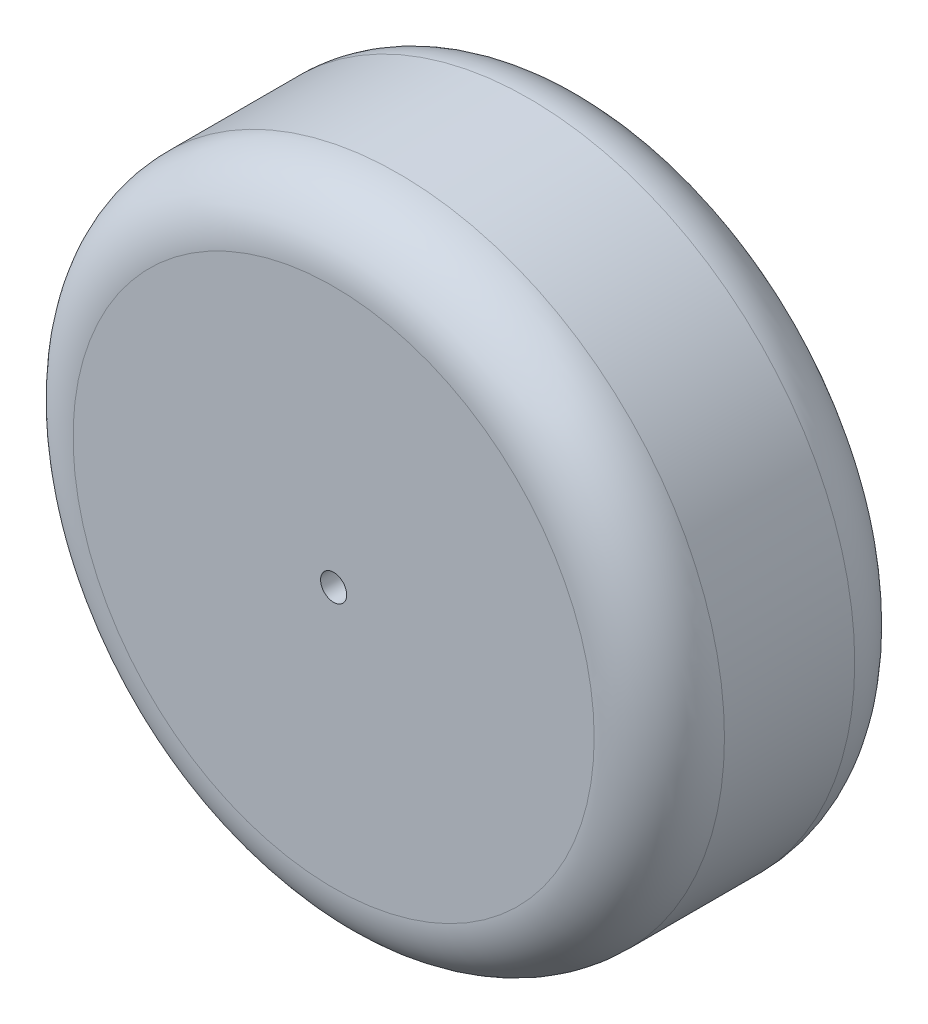
ISO-10303-21;
HEADER;
FILE_DESCRIPTION(('STEP AP214'),'2;1');
FILE_NAME('part.step','',(''),(''),'','','');
FILE_SCHEMA(('AUTOMOTIVE_DESIGN { 1 0 10303 214 1 1 1 1 }'));
ENDSEC;
DATA;
#1=APPLICATION_CONTEXT('core data for automotive mechanical design processes');
#2=APPLICATION_PROTOCOL_DEFINITION('international standard','automotive_design',2000,#1);
#3=PRODUCT_CONTEXT('',#1,'mechanical');
#4=PRODUCT('Part','Part','',(#3));
#5=PRODUCT_RELATED_PRODUCT_CATEGORY('part','',(#4));
#6=PRODUCT_DEFINITION_FORMATION('','',#4);
#7=PRODUCT_DEFINITION_CONTEXT('part definition',#1,'design');
#8=PRODUCT_DEFINITION('design','',#6,#7);
#9=PRODUCT_DEFINITION_SHAPE('','',#8);
#10=(LENGTH_UNIT() NAMED_UNIT(*) SI_UNIT(.MILLI.,.METRE.));
#11=(NAMED_UNIT(*) PLANE_ANGLE_UNIT() SI_UNIT($,.RADIAN.));
#12=(NAMED_UNIT(*) SI_UNIT($,.STERADIAN.) SOLID_ANGLE_UNIT());
#13=UNCERTAINTY_MEASURE_WITH_UNIT(LENGTH_MEASURE(1.E-05),#10,'distance_accuracy_value','');
#14=(GEOMETRIC_REPRESENTATION_CONTEXT(3) GLOBAL_UNCERTAINTY_ASSIGNED_CONTEXT((#13)) GLOBAL_UNIT_ASSIGNED_CONTEXT((#10,
#11,#12)) REPRESENTATION_CONTEXT('',''));
#15=CARTESIAN_POINT('',(0.,0.,0.));
#16=DIRECTION('',(0.,0.,1.));
#17=DIRECTION('',(1.,0.,0.));
#18=AXIS2_PLACEMENT_3D('',#15,#16,#17);
#19=CARTESIAN_POINT('',(0.,0.,20.));
#20=DIRECTION('',(0.,0.,-1.));
#21=DIRECTION('',(-1.,0.,0.));
#22=AXIS2_PLACEMENT_3D('',#19,#20,#21);
#23=CYLINDRICAL_SURFACE('',#22,25.);
#24=CARTESIAN_POINT('',(0.,0.,5.));
#25=DIRECTION('',(0.,0.,1.));
#26=DIRECTION('',(1.,0.,0.));
#27=AXIS2_PLACEMENT_3D('',#24,#25,#26);
#28=CIRCLE('',#27,25.);
#29=CARTESIAN_POINT('',(25.,0.,5.));
#30=VERTEX_POINT('',#29);
#31=EDGE_CURVE('E56',#30,#30,#28,.T.);
#32=ORIENTED_EDGE('',*,*,#31,.T.);
#33=EDGE_LOOP('',(#32));
#34=FACE_BOUND('',#33,.T.);
#35=CARTESIAN_POINT('',(0.,0.,15.));
#36=DIRECTION('',(0.,0.,1.));
#37=DIRECTION('',(1.,0.,0.));
#38=AXIS2_PLACEMENT_3D('',#35,#36,#37);
#39=CIRCLE('',#38,25.);
#40=CARTESIAN_POINT('',(25.,0.,15.));
#41=VERTEX_POINT('',#40);
#42=EDGE_CURVE('E61',#41,#41,#39,.F.);
#43=ORIENTED_EDGE('',*,*,#42,.T.);
#44=EDGE_LOOP('',(#43));
#45=FACE_BOUND('',#44,.T.);
#46=ADVANCED_FACE('F43',(#34,#45),#23,.T.);
#47=CARTESIAN_POINT('',(0.,0.,20.));
#48=DIRECTION('',(0.,0.,1.));
#49=DIRECTION('',(1.,0.,0.));
#50=AXIS2_PLACEMENT_3D('',#47,#48,#49);
#51=PLANE('',#50);
#52=CARTESIAN_POINT('',(0.,0.,20.));
#53=DIRECTION('',(0.,0.,1.));
#54=DIRECTION('',(1.,0.,0.));
#55=AXIS2_PLACEMENT_3D('',#52,#53,#54);
#56=CIRCLE('',#55,20.);
#57=CARTESIAN_POINT('',(20.,0.,20.));
#58=VERTEX_POINT('',#57);
#59=EDGE_CURVE('E10',#58,#58,#56,.T.);
#60=ORIENTED_EDGE('',*,*,#59,.T.);
#61=EDGE_LOOP('',(#60));
#62=FACE_BOUND('',#61,.T.);
#63=CARTESIAN_POINT('',(0.,0.,20.));
#64=DIRECTION('',(0.,0.,1.));
#65=DIRECTION('',(1.,0.,0.));
#66=AXIS2_PLACEMENT_3D('',#63,#64,#65);
#67=CIRCLE('',#66,1.);
#68=CARTESIAN_POINT('',(1.,0.,20.));
#69=VERTEX_POINT('',#68);
#70=EDGE_CURVE('E68',#69,#69,#67,.T.);
#71=ORIENTED_EDGE('',*,*,#70,.F.);
#72=EDGE_LOOP('',(#71));
#73=FACE_BOUND('',#72,.T.);
#74=ADVANCED_FACE('F85',(#62,#73),#51,.T.);
#75=CARTESIAN_POINT('',(0.,0.,0.));
#76=DIRECTION('',(0.,0.,1.));
#77=DIRECTION('',(1.,0.,0.));
#78=AXIS2_PLACEMENT_3D('',#75,#76,#77);
#79=PLANE('',#78);
#80=CARTESIAN_POINT('',(0.,0.,0.));
#81=DIRECTION('',(0.,0.,1.));
#82=DIRECTION('',(1.,0.,0.));
#83=AXIS2_PLACEMENT_3D('',#80,#81,#82);
#84=CIRCLE('',#83,20.);
#85=CARTESIAN_POINT('',(20.,0.,0.));
#86=VERTEX_POINT('',#85);
#87=EDGE_CURVE('E51',#86,#86,#84,.F.);
#88=ORIENTED_EDGE('',*,*,#87,.T.);
#89=EDGE_LOOP('',(#88));
#90=FACE_BOUND('',#89,.T.);
#91=ADVANCED_FACE('F81',(#90),#79,.F.);
#92=CARTESIAN_POINT('',(0.,0.,14.));
#93=DIRECTION('',(0.,0.,1.));
#94=DIRECTION('',(1.,0.,0.));
#95=AXIS2_PLACEMENT_3D('',#92,#93,#94);
#96=CYLINDRICAL_SURFACE('',#95,1.);
#97=CARTESIAN_POINT('',(0.,0.,14.));
#98=DIRECTION('',(0.,0.,1.));
#99=DIRECTION('',(1.,0.,0.));
#100=AXIS2_PLACEMENT_3D('',#97,#98,#99);
#101=CIRCLE('',#100,1.);
#102=CARTESIAN_POINT('',(1.,0.,14.));
#103=VERTEX_POINT('',#102);
#104=EDGE_CURVE('E67',#103,#103,#101,.T.);
#105=ORIENTED_EDGE('',*,*,#104,.F.);
#106=EDGE_LOOP('',(#105));
#107=FACE_BOUND('',#106,.T.);
#108=ORIENTED_EDGE('',*,*,#70,.T.);
#109=EDGE_LOOP('',(#108));
#110=FACE_BOUND('',#109,.T.);
#111=ADVANCED_FACE('F78',(#107,#110),#96,.F.);
#112=CARTESIAN_POINT('',(0.,0.,14.));
#113=DIRECTION('',(0.,0.,1.));
#114=DIRECTION('',(1.,0.,0.));
#115=AXIS2_PLACEMENT_3D('',#112,#113,#114);
#116=PLANE('',#115);
#117=ORIENTED_EDGE('',*,*,#104,.T.);
#118=EDGE_LOOP('',(#117));
#119=FACE_BOUND('',#118,.T.);
#120=ADVANCED_FACE('F76',(#119),#116,.T.);
#121=CARTESIAN_POINT('',(0.,0.,5.));
#122=DIRECTION('',(0.,0.,1.));
#123=DIRECTION('',(1.,0.,0.));
#124=AXIS2_PLACEMENT_3D('',#121,#122,#123);
#125=TOROIDAL_SURFACE('',#124,20.,5.);
#126=ORIENTED_EDGE('',*,*,#87,.F.);
#127=EDGE_LOOP('',(#126));
#128=FACE_BOUND('',#127,.T.);
#129=ORIENTED_EDGE('',*,*,#31,.F.);
#130=EDGE_LOOP('',(#129));
#131=FACE_BOUND('',#130,.T.);
#132=ADVANCED_FACE('F96',(#128,#131),#125,.T.);
#133=CARTESIAN_POINT('',(0.,0.,15.));
#134=DIRECTION('',(0.,0.,1.));
#135=DIRECTION('',(1.,0.,0.));
#136=AXIS2_PLACEMENT_3D('',#133,#134,#135);
#137=TOROIDAL_SURFACE('',#136,20.,5.);
#138=ORIENTED_EDGE('',*,*,#42,.F.);
#139=EDGE_LOOP('',(#138));
#140=FACE_BOUND('',#139,.T.);
#141=ORIENTED_EDGE('',*,*,#59,.F.);
#142=EDGE_LOOP('',(#141));
#143=FACE_BOUND('',#142,.T.);
#144=ADVANCED_FACE('F45',(#140,#143),#137,.T.);
#145=CLOSED_SHELL('',(#46,#74,#91,#111,#120,#132,#144));
#146=MANIFOLD_SOLID_BREP('B2',#145);
#147=ADVANCED_BREP_SHAPE_REPRESENTATION('',(#18,#146),#14);
#148=SHAPE_DEFINITION_REPRESENTATION(#9,#147);
ENDSEC;
END-ISO-10303-21;
